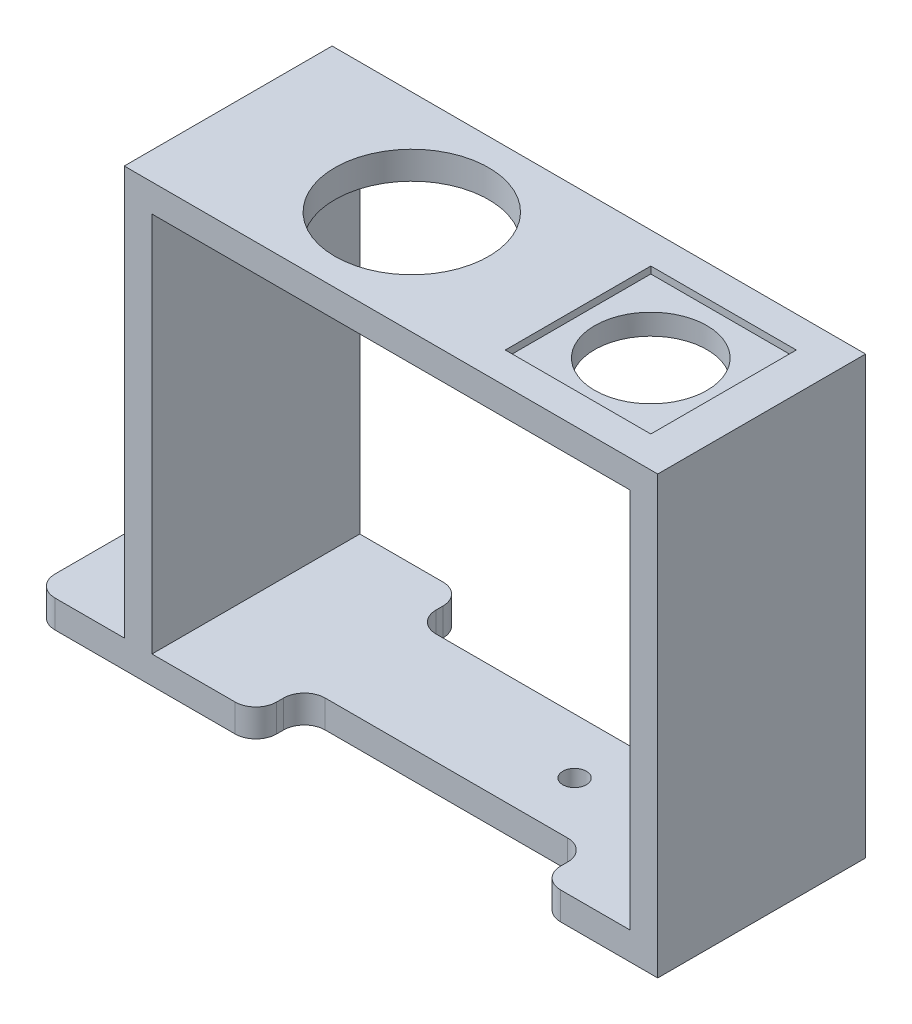
ISO-10303-21;
HEADER;
FILE_DESCRIPTION(('STEP AP214'),'2;1');
FILE_NAME('part.step','',(''),(''),'','','');
FILE_SCHEMA(('AUTOMOTIVE_DESIGN { 1 0 10303 214 1 1 1 1 }'));
ENDSEC;
DATA;
#1=APPLICATION_CONTEXT('core data for automotive mechanical design processes');
#2=APPLICATION_PROTOCOL_DEFINITION('international standard','automotive_design',2000,#1);
#3=PRODUCT_CONTEXT('',#1,'mechanical');
#4=PRODUCT('Part','Part','',(#3));
#5=PRODUCT_RELATED_PRODUCT_CATEGORY('part','',(#4));
#6=PRODUCT_DEFINITION_FORMATION('','',#4);
#7=PRODUCT_DEFINITION_CONTEXT('part definition',#1,'design');
#8=PRODUCT_DEFINITION('design','',#6,#7);
#9=PRODUCT_DEFINITION_SHAPE('','',#8);
#10=(LENGTH_UNIT() NAMED_UNIT(*) SI_UNIT(.MILLI.,.METRE.));
#11=(NAMED_UNIT(*) PLANE_ANGLE_UNIT() SI_UNIT($,.RADIAN.));
#12=(NAMED_UNIT(*) SI_UNIT($,.STERADIAN.) SOLID_ANGLE_UNIT());
#13=UNCERTAINTY_MEASURE_WITH_UNIT(LENGTH_MEASURE(1.E-05),#10,'distance_accuracy_value','');
#14=(GEOMETRIC_REPRESENTATION_CONTEXT(3) GLOBAL_UNCERTAINTY_ASSIGNED_CONTEXT((#13)) GLOBAL_UNIT_ASSIGNED_CONTEXT((#10,
#11,#12)) REPRESENTATION_CONTEXT('',''));
#15=CARTESIAN_POINT('',(0.,0.,0.));
#16=DIRECTION('',(0.,0.,1.));
#17=DIRECTION('',(1.,0.,0.));
#18=AXIS2_PLACEMENT_3D('',#15,#16,#17);
#19=CARTESIAN_POINT('',(0.,4.,0.));
#20=DIRECTION('',(0.,-1.,0.));
#21=DIRECTION('',(0.,0.,-1.));
#22=AXIS2_PLACEMENT_3D('',#19,#20,#21);
#23=PLANE('',#22);
#24=CARTESIAN_POINT('',(18.,4.,0.));
#25=DIRECTION('',(0.,1.,0.));
#26=DIRECTION('',(0.,0.,1.));
#27=AXIS2_PLACEMENT_3D('',#24,#25,#26);
#28=CIRCLE('',#27,1.7);
#29=CARTESIAN_POINT('',(18.,4.,1.7));
#30=VERTEX_POINT('',#29);
#31=EDGE_CURVE('E274',#30,#30,#28,.T.);
#32=ORIENTED_EDGE('',*,*,#31,.F.);
#33=EDGE_LOOP('',(#32));
#34=FACE_BOUND('',#33,.T.);
#35=DIRECTION('',(0.,0.,-1.));
#36=VECTOR('',#35,1.);
#37=CARTESIAN_POINT('',(28.,4.,15.));
#38=LINE('',#37,#36);
#39=CARTESIAN_POINT('',(28.,4.,12.));
#40=VERTEX_POINT('',#39);
#41=CARTESIAN_POINT('',(28.,4.,11.));
#42=VERTEX_POINT('',#41);
#43=EDGE_CURVE('E524',#40,#42,#38,.T.);
#44=ORIENTED_EDGE('',*,*,#43,.F.);
#45=CARTESIAN_POINT('',(31.,4.,12.));
#46=DIRECTION('',(0.,-1.,0.));
#47=DIRECTION('',(0.,0.,-1.));
#48=AXIS2_PLACEMENT_3D('',#45,#46,#47);
#49=CIRCLE('',#48,3.);
#50=CARTESIAN_POINT('',(31.,4.,15.));
#51=VERTEX_POINT('',#50);
#52=EDGE_CURVE('E451',#40,#51,#49,.F.);
#53=ORIENTED_EDGE('',*,*,#52,.T.);
#54=DIRECTION('',(1.,0.,0.));
#55=VECTOR('',#54,1.);
#56=CARTESIAN_POINT('',(-45.,4.,15.));
#57=LINE('',#56,#55);
#58=CARTESIAN_POINT('',(41.,4.,15.));
#59=VERTEX_POINT('',#58);
#60=EDGE_CURVE('E366',#51,#59,#57,.T.);
#61=ORIENTED_EDGE('',*,*,#60,.T.);
#62=DIRECTION('',(0.,0.,1.));
#63=VECTOR('',#62,1.);
#64=CARTESIAN_POINT('',(41.,4.,-15.));
#65=LINE('',#64,#63);
#66=CARTESIAN_POINT('',(41.,4.,-15.));
#67=VERTEX_POINT('',#66);
#68=EDGE_CURVE('E314',#67,#59,#65,.T.);
#69=ORIENTED_EDGE('',*,*,#68,.F.);
#70=DIRECTION('',(-1.,0.,0.));
#71=VECTOR('',#70,1.);
#72=CARTESIAN_POINT('',(-45.,4.,-15.));
#73=LINE('',#72,#71);
#74=CARTESIAN_POINT('',(31.,4.,-15.));
#75=VERTEX_POINT('',#74);
#76=EDGE_CURVE('E358',#67,#75,#73,.T.);
#77=ORIENTED_EDGE('',*,*,#76,.T.);
#78=CARTESIAN_POINT('',(31.,4.,-12.));
#79=DIRECTION('',(0.,-1.,0.));
#80=DIRECTION('',(0.,0.,-1.));
#81=AXIS2_PLACEMENT_3D('',#78,#79,#80);
#82=CIRCLE('',#81,3.);
#83=CARTESIAN_POINT('',(28.,4.,-12.));
#84=VERTEX_POINT('',#83);
#85=EDGE_CURVE('E445',#75,#84,#82,.F.);
#86=ORIENTED_EDGE('',*,*,#85,.T.);
#87=DIRECTION('',(0.,0.,-1.));
#88=VECTOR('',#87,1.);
#89=CARTESIAN_POINT('',(28.,4.,-15.));
#90=LINE('',#89,#88);
#91=CARTESIAN_POINT('',(28.,4.,-11.));
#92=VERTEX_POINT('',#91);
#93=EDGE_CURVE('E486',#92,#84,#90,.T.);
#94=ORIENTED_EDGE('',*,*,#93,.F.);
#95=CARTESIAN_POINT('',(25.,4.,-11.));
#96=DIRECTION('',(0.,-1.,0.));
#97=DIRECTION('',(0.,0.,-1.));
#98=AXIS2_PLACEMENT_3D('',#95,#96,#97);
#99=CIRCLE('',#98,3.);
#100=CARTESIAN_POINT('',(25.,4.,-8.));
#101=VERTEX_POINT('',#100);
#102=EDGE_CURVE('E42',#92,#101,#99,.T.);
#103=ORIENTED_EDGE('',*,*,#102,.T.);
#104=DIRECTION('',(1.,0.,0.));
#105=VECTOR('',#104,1.);
#106=CARTESIAN_POINT('',(28.,4.,-8.));
#107=LINE('',#106,#105);
#108=CARTESIAN_POINT('',(-10.,4.,-7.99999999999999));
#109=VERTEX_POINT('',#108);
#110=EDGE_CURVE('E484',#109,#101,#107,.T.);
#111=ORIENTED_EDGE('',*,*,#110,.F.);
#112=CARTESIAN_POINT('',(-10.,4.,-11.));
#113=DIRECTION('',(0.,-1.,0.));
#114=DIRECTION('',(0.,0.,-1.));
#115=AXIS2_PLACEMENT_3D('',#112,#113,#114);
#116=CIRCLE('',#115,3.);
#117=CARTESIAN_POINT('',(-13.,4.,-11.));
#118=VERTEX_POINT('',#117);
#119=EDGE_CURVE('E49',#109,#118,#116,.T.);
#120=ORIENTED_EDGE('',*,*,#119,.T.);
#121=DIRECTION('',(0.,0.,1.));
#122=VECTOR('',#121,1.);
#123=CARTESIAN_POINT('',(-13.,4.,-15.));
#124=LINE('',#123,#122);
#125=CARTESIAN_POINT('',(-13.,4.,-12.));
#126=VERTEX_POINT('',#125);
#127=EDGE_CURVE('E495',#126,#118,#124,.T.);
#128=ORIENTED_EDGE('',*,*,#127,.F.);
#129=CARTESIAN_POINT('',(-16.,4.,-12.));
#130=DIRECTION('',(0.,-1.,0.));
#131=DIRECTION('',(0.,0.,-1.));
#132=AXIS2_PLACEMENT_3D('',#129,#130,#131);
#133=CIRCLE('',#132,3.);
#134=CARTESIAN_POINT('',(-16.,4.,-15.));
#135=VERTEX_POINT('',#134);
#136=EDGE_CURVE('E447',#126,#135,#133,.F.);
#137=ORIENTED_EDGE('',*,*,#136,.T.);
#138=CARTESIAN_POINT('',(-28.,4.,-15.));
#139=VERTEX_POINT('',#138);
#140=EDGE_CURVE('E362',#135,#139,#73,.T.);
#141=ORIENTED_EDGE('',*,*,#140,.T.);
#142=DIRECTION('',(0.,0.,-1.));
#143=VECTOR('',#142,1.);
#144=CARTESIAN_POINT('',(-28.,4.,-15.));
#145=LINE('',#144,#143);
#146=CARTESIAN_POINT('',(-28.,4.,15.));
#147=VERTEX_POINT('',#146);
#148=EDGE_CURVE('E335',#147,#139,#145,.T.);
#149=ORIENTED_EDGE('',*,*,#148,.F.);
#150=CARTESIAN_POINT('',(-16.,4.,15.));
#151=VERTEX_POINT('',#150);
#152=EDGE_CURVE('E368',#147,#151,#57,.T.);
#153=ORIENTED_EDGE('',*,*,#152,.T.);
#154=CARTESIAN_POINT('',(-16.,4.,12.));
#155=DIRECTION('',(0.,-1.,0.));
#156=DIRECTION('',(0.,0.,-1.));
#157=AXIS2_PLACEMENT_3D('',#154,#155,#156);
#158=CIRCLE('',#157,3.);
#159=CARTESIAN_POINT('',(-13.,4.,12.));
#160=VERTEX_POINT('',#159);
#161=EDGE_CURVE('E449',#151,#160,#158,.F.);
#162=ORIENTED_EDGE('',*,*,#161,.T.);
#163=DIRECTION('',(0.,0.,1.));
#164=VECTOR('',#163,1.);
#165=CARTESIAN_POINT('',(-13.,4.,15.));
#166=LINE('',#165,#164);
#167=CARTESIAN_POINT('',(-13.,4.,11.));
#168=VERTEX_POINT('',#167);
#169=EDGE_CURVE('E494',#168,#160,#166,.T.);
#170=ORIENTED_EDGE('',*,*,#169,.F.);
#171=CARTESIAN_POINT('',(-10.,4.,11.));
#172=DIRECTION('',(0.,-1.,0.));
#173=DIRECTION('',(0.,0.,-1.));
#174=AXIS2_PLACEMENT_3D('',#171,#172,#173);
#175=CIRCLE('',#174,3.);
#176=CARTESIAN_POINT('',(-10.,4.,8.));
#177=VERTEX_POINT('',#176);
#178=EDGE_CURVE('E475',#168,#177,#175,.T.);
#179=ORIENTED_EDGE('',*,*,#178,.T.);
#180=DIRECTION('',(-1.,0.,0.));
#181=VECTOR('',#180,1.);
#182=CARTESIAN_POINT('',(-13.,4.,8.));
#183=LINE('',#182,#181);
#184=CARTESIAN_POINT('',(25.,4.,8.));
#185=VERTEX_POINT('',#184);
#186=EDGE_CURVE('E518',#185,#177,#183,.T.);
#187=ORIENTED_EDGE('',*,*,#186,.F.);
#188=CARTESIAN_POINT('',(25.,4.,11.));
#189=DIRECTION('',(0.,-1.,0.));
#190=DIRECTION('',(0.,0.,-1.));
#191=AXIS2_PLACEMENT_3D('',#188,#189,#190);
#192=CIRCLE('',#191,3.);
#193=EDGE_CURVE('E471',#185,#42,#192,.T.);
#194=ORIENTED_EDGE('',*,*,#193,.T.);
#195=EDGE_LOOP('',(#44,#53,#61,#69,#77,#86,#94,#103,#111,#120,#128,#137,#141,#149,#153,#162,
#170,#179,#187,#194));
#196=FACE_BOUND('',#195,.T.);
#197=ADVANCED_FACE('F34',(#34,#196),#23,.F.);
#198=CARTESIAN_POINT('',(-40.,4.,0.));
#199=DIRECTION('',(0.,1.,0.));
#200=DIRECTION('',(0.,0.,1.));
#201=AXIS2_PLACEMENT_3D('',#198,#199,#200);
#202=CIRCLE('',#201,1.7);
#203=CARTESIAN_POINT('',(-40.,4.,1.7));
#204=VERTEX_POINT('',#203);
#205=EDGE_CURVE('E352',#204,#204,#202,.T.);
#206=ORIENTED_EDGE('',*,*,#205,.F.);
#207=EDGE_LOOP('',(#206));
#208=FACE_BOUND('',#207,.T.);
#209=CARTESIAN_POINT('',(-32.,4.,-15.));
#210=VERTEX_POINT('',#209);
#211=CARTESIAN_POINT('',(-42.,4.,-15.));
#212=VERTEX_POINT('',#211);
#213=EDGE_CURVE('E363',#210,#212,#73,.T.);
#214=ORIENTED_EDGE('',*,*,#213,.T.);
#215=CARTESIAN_POINT('',(-42.,4.,-12.));
#216=DIRECTION('',(0.,-1.,0.));
#217=DIRECTION('',(0.,0.,-1.));
#218=AXIS2_PLACEMENT_3D('',#215,#216,#217);
#219=CIRCLE('',#218,3.);
#220=CARTESIAN_POINT('',(-45.,4.,-12.));
#221=VERTEX_POINT('',#220);
#222=EDGE_CURVE('E425',#212,#221,#219,.F.);
#223=ORIENTED_EDGE('',*,*,#222,.T.);
#224=DIRECTION('',(0.,0.,1.));
#225=VECTOR('',#224,1.);
#226=CARTESIAN_POINT('',(-45.,4.,15.));
#227=LINE('',#226,#225);
#228=CARTESIAN_POINT('',(-45.,4.,12.));
#229=VERTEX_POINT('',#228);
#230=EDGE_CURVE('E361',#221,#229,#227,.T.);
#231=ORIENTED_EDGE('',*,*,#230,.T.);
#232=CARTESIAN_POINT('',(-42.,4.,12.));
#233=DIRECTION('',(0.,-1.,0.));
#234=DIRECTION('',(0.,0.,-1.));
#235=AXIS2_PLACEMENT_3D('',#232,#233,#234);
#236=CIRCLE('',#235,3.);
#237=CARTESIAN_POINT('',(-42.,4.,15.));
#238=VERTEX_POINT('',#237);
#239=EDGE_CURVE('E423',#229,#238,#236,.F.);
#240=ORIENTED_EDGE('',*,*,#239,.T.);
#241=CARTESIAN_POINT('',(-32.,4.,15.));
#242=VERTEX_POINT('',#241);
#243=EDGE_CURVE('E369',#238,#242,#57,.T.);
#244=ORIENTED_EDGE('',*,*,#243,.T.);
#245=DIRECTION('',(0.,0.,1.));
#246=VECTOR('',#245,1.);
#247=CARTESIAN_POINT('',(-32.,4.,-15.));
#248=LINE('',#247,#246);
#249=EDGE_CURVE('E330',#210,#242,#248,.T.);
#250=ORIENTED_EDGE('',*,*,#249,.F.);
#251=EDGE_LOOP('',(#214,#223,#231,#240,#244,#250));
#252=FACE_BOUND('',#251,.T.);
#253=ADVANCED_FACE('F566',(#208,#252),#23,.F.);
#254=CARTESIAN_POINT('',(0.,0.,0.));
#255=DIRECTION('',(0.,-1.,0.));
#256=DIRECTION('',(0.,0.,-1.));
#257=AXIS2_PLACEMENT_3D('',#254,#255,#256);
#258=PLANE('',#257);
#259=DIRECTION('',(0.,0.,1.));
#260=VECTOR('',#259,1.);
#261=CARTESIAN_POINT('',(-45.,0.,15.));
#262=LINE('',#261,#260);
#263=CARTESIAN_POINT('',(-45.,0.,-12.));
#264=VERTEX_POINT('',#263);
#265=CARTESIAN_POINT('',(-45.,0.,12.));
#266=VERTEX_POINT('',#265);
#267=EDGE_CURVE('E376',#264,#266,#262,.T.);
#268=ORIENTED_EDGE('',*,*,#267,.F.);
#269=CARTESIAN_POINT('',(-42.,0.,-12.));
#270=DIRECTION('',(0.,-1.,0.));
#271=DIRECTION('',(0.,0.,-1.));
#272=AXIS2_PLACEMENT_3D('',#269,#270,#271);
#273=CIRCLE('',#272,3.);
#274=CARTESIAN_POINT('',(-42.,0.,-15.));
#275=VERTEX_POINT('',#274);
#276=EDGE_CURVE('E413',#264,#275,#273,.T.);
#277=ORIENTED_EDGE('',*,*,#276,.T.);
#278=DIRECTION('',(-1.,0.,0.));
#279=VECTOR('',#278,1.);
#280=CARTESIAN_POINT('',(-45.,0.,-15.));
#281=LINE('',#280,#279);
#282=CARTESIAN_POINT('',(-16.,0.,-15.));
#283=VERTEX_POINT('',#282);
#284=EDGE_CURVE('E372',#283,#275,#281,.T.);
#285=ORIENTED_EDGE('',*,*,#284,.F.);
#286=CARTESIAN_POINT('',(-16.,0.,-12.));
#287=DIRECTION('',(0.,-1.,0.));
#288=DIRECTION('',(0.,0.,-1.));
#289=AXIS2_PLACEMENT_3D('',#286,#287,#288);
#290=CIRCLE('',#289,3.);
#291=CARTESIAN_POINT('',(-13.,0.,-12.));
#292=VERTEX_POINT('',#291);
#293=EDGE_CURVE('E405',#283,#292,#290,.T.);
#294=ORIENTED_EDGE('',*,*,#293,.T.);
#295=DIRECTION('',(0.,0.,-1.));
#296=VECTOR('',#295,1.);
#297=CARTESIAN_POINT('',(-13.,0.,0.));
#298=LINE('',#297,#296);
#299=CARTESIAN_POINT('',(-13.,0.,-11.));
#300=VERTEX_POINT('',#299);
#301=EDGE_CURVE('E509',#300,#292,#298,.T.);
#302=ORIENTED_EDGE('',*,*,#301,.F.);
#303=CARTESIAN_POINT('',(-10.,0.,-11.));
#304=DIRECTION('',(0.,-1.,0.));
#305=DIRECTION('',(0.,0.,-1.));
#306=AXIS2_PLACEMENT_3D('',#303,#304,#305);
#307=CIRCLE('',#306,3.);
#308=CARTESIAN_POINT('',(-10.,0.,-7.99999999999999));
#309=VERTEX_POINT('',#308);
#310=EDGE_CURVE('E480',#300,#309,#307,.F.);
#311=ORIENTED_EDGE('',*,*,#310,.T.);
#312=DIRECTION('',(-1.,0.,0.));
#313=VECTOR('',#312,1.);
#314=CARTESIAN_POINT('',(0.,0.,-7.99999999999999));
#315=LINE('',#314,#313);
#316=CARTESIAN_POINT('',(25.,0.,-8.));
#317=VERTEX_POINT('',#316);
#318=EDGE_CURVE('E388',#317,#309,#315,.T.);
#319=ORIENTED_EDGE('',*,*,#318,.F.);
#320=CARTESIAN_POINT('',(25.,0.,-11.));
#321=DIRECTION('',(0.,-1.,0.));
#322=DIRECTION('',(0.,0.,-1.));
#323=AXIS2_PLACEMENT_3D('',#320,#321,#322);
#324=CIRCLE('',#323,3.);
#325=CARTESIAN_POINT('',(28.,0.,-11.));
#326=VERTEX_POINT('',#325);
#327=EDGE_CURVE('E11',#317,#326,#324,.F.);
#328=ORIENTED_EDGE('',*,*,#327,.T.);
#329=DIRECTION('',(0.,0.,1.));
#330=VECTOR('',#329,1.);
#331=CARTESIAN_POINT('',(28.,0.,0.));
#332=LINE('',#331,#330);
#333=CARTESIAN_POINT('',(28.,0.,-12.));
#334=VERTEX_POINT('',#333);
#335=EDGE_CURVE('E504',#334,#326,#332,.T.);
#336=ORIENTED_EDGE('',*,*,#335,.F.);
#337=CARTESIAN_POINT('',(31.,0.,-12.));
#338=DIRECTION('',(0.,-1.,0.));
#339=DIRECTION('',(0.,0.,-1.));
#340=AXIS2_PLACEMENT_3D('',#337,#338,#339);
#341=CIRCLE('',#340,3.);
#342=CARTESIAN_POINT('',(31.,0.,-15.));
#343=VERTEX_POINT('',#342);
#344=EDGE_CURVE('E403',#334,#343,#341,.T.);
#345=ORIENTED_EDGE('',*,*,#344,.T.);
#346=CARTESIAN_POINT('',(45.,0.,-15.));
#347=VERTEX_POINT('',#346);
#348=EDGE_CURVE('E373',#347,#343,#281,.T.);
#349=ORIENTED_EDGE('',*,*,#348,.F.);
#350=DIRECTION('',(0.,0.,-1.));
#351=VECTOR('',#350,1.);
#352=CARTESIAN_POINT('',(45.,0.,15.));
#353=LINE('',#352,#351);
#354=CARTESIAN_POINT('',(45.,0.,15.));
#355=VERTEX_POINT('',#354);
#356=EDGE_CURVE('E355',#355,#347,#353,.T.);
#357=ORIENTED_EDGE('',*,*,#356,.F.);
#358=DIRECTION('',(1.,0.,0.));
#359=VECTOR('',#358,1.);
#360=CARTESIAN_POINT('',(-45.,0.,15.));
#361=LINE('',#360,#359);
#362=CARTESIAN_POINT('',(31.,0.,15.));
#363=VERTEX_POINT('',#362);
#364=EDGE_CURVE('E379',#363,#355,#361,.T.);
#365=ORIENTED_EDGE('',*,*,#364,.F.);
#366=CARTESIAN_POINT('',(31.,0.,12.));
#367=DIRECTION('',(0.,-1.,0.));
#368=DIRECTION('',(0.,0.,-1.));
#369=AXIS2_PLACEMENT_3D('',#366,#367,#368);
#370=CIRCLE('',#369,3.);
#371=CARTESIAN_POINT('',(28.,0.,12.));
#372=VERTEX_POINT('',#371);
#373=EDGE_CURVE('E409',#363,#372,#370,.T.);
#374=ORIENTED_EDGE('',*,*,#373,.T.);
#375=DIRECTION('',(0.,0.,1.));
#376=VECTOR('',#375,1.);
#377=CARTESIAN_POINT('',(28.,0.,0.));
#378=LINE('',#377,#376);
#379=CARTESIAN_POINT('',(28.,0.,11.));
#380=VERTEX_POINT('',#379);
#381=EDGE_CURVE('E516',#380,#372,#378,.T.);
#382=ORIENTED_EDGE('',*,*,#381,.F.);
#383=CARTESIAN_POINT('',(25.,0.,11.));
#384=DIRECTION('',(0.,-1.,0.));
#385=DIRECTION('',(0.,0.,-1.));
#386=AXIS2_PLACEMENT_3D('',#383,#384,#385);
#387=CIRCLE('',#386,3.);
#388=CARTESIAN_POINT('',(25.,0.,8.));
#389=VERTEX_POINT('',#388);
#390=EDGE_CURVE('E473',#380,#389,#387,.F.);
#391=ORIENTED_EDGE('',*,*,#390,.T.);
#392=DIRECTION('',(1.,0.,0.));
#393=VECTOR('',#392,1.);
#394=CARTESIAN_POINT('',(0.,0.,8.));
#395=LINE('',#394,#393);
#396=CARTESIAN_POINT('',(-10.,0.,8.));
#397=VERTEX_POINT('',#396);
#398=EDGE_CURVE('E395',#397,#389,#395,.T.);
#399=ORIENTED_EDGE('',*,*,#398,.F.);
#400=CARTESIAN_POINT('',(-10.,0.,11.));
#401=DIRECTION('',(0.,-1.,0.));
#402=DIRECTION('',(0.,0.,-1.));
#403=AXIS2_PLACEMENT_3D('',#400,#401,#402);
#404=CIRCLE('',#403,3.);
#405=CARTESIAN_POINT('',(-13.,0.,11.));
#406=VERTEX_POINT('',#405);
#407=EDGE_CURVE('E477',#397,#406,#404,.F.);
#408=ORIENTED_EDGE('',*,*,#407,.T.);
#409=DIRECTION('',(0.,0.,-1.));
#410=VECTOR('',#409,1.);
#411=CARTESIAN_POINT('',(-13.,0.,0.));
#412=LINE('',#411,#410);
#413=CARTESIAN_POINT('',(-13.,0.,12.));
#414=VERTEX_POINT('',#413);
#415=EDGE_CURVE('E511',#414,#406,#412,.T.);
#416=ORIENTED_EDGE('',*,*,#415,.F.);
#417=CARTESIAN_POINT('',(-16.,0.,12.));
#418=DIRECTION('',(0.,-1.,0.));
#419=DIRECTION('',(0.,0.,-1.));
#420=AXIS2_PLACEMENT_3D('',#417,#418,#419);
#421=CIRCLE('',#420,3.);
#422=CARTESIAN_POINT('',(-16.,0.,15.));
#423=VERTEX_POINT('',#422);
#424=EDGE_CURVE('E407',#414,#423,#421,.T.);
#425=ORIENTED_EDGE('',*,*,#424,.T.);
#426=CARTESIAN_POINT('',(-42.,0.,15.));
#427=VERTEX_POINT('',#426);
#428=EDGE_CURVE('E381',#427,#423,#361,.T.);
#429=ORIENTED_EDGE('',*,*,#428,.F.);
#430=CARTESIAN_POINT('',(-42.,0.,12.));
#431=DIRECTION('',(0.,-1.,0.));
#432=DIRECTION('',(0.,0.,-1.));
#433=AXIS2_PLACEMENT_3D('',#430,#431,#432);
#434=CIRCLE('',#433,3.);
#435=EDGE_CURVE('E411',#427,#266,#434,.T.);
#436=ORIENTED_EDGE('',*,*,#435,.T.);
#437=EDGE_LOOP('',(#268,#277,#285,#294,#302,#311,#319,#328,#336,#345,#349,#357,#365,#374,#382,
#391,#399,#408,#416,#425,#429,#436));
#438=FACE_BOUND('',#437,.T.);
#439=CARTESIAN_POINT('',(18.,0.,0.));
#440=DIRECTION('',(0.,-1.,0.));
#441=DIRECTION('',(0.,0.,-1.));
#442=AXIS2_PLACEMENT_3D('',#439,#440,#441);
#443=CIRCLE('',#442,1.7);
#444=CARTESIAN_POINT('',(18.,0.,-1.7));
#445=VERTEX_POINT('',#444);
#446=EDGE_CURVE('E281',#445,#445,#443,.T.);
#447=ORIENTED_EDGE('',*,*,#446,.F.);
#448=EDGE_LOOP('',(#447));
#449=FACE_BOUND('',#448,.T.);
#450=CARTESIAN_POINT('',(-40.,0.,0.));
#451=DIRECTION('',(0.,1.,0.));
#452=DIRECTION('',(0.,0.,1.));
#453=AXIS2_PLACEMENT_3D('',#450,#451,#452);
#454=CIRCLE('',#453,1.7);
#455=CARTESIAN_POINT('',(-40.,0.,1.7));
#456=VERTEX_POINT('',#455);
#457=EDGE_CURVE('E351',#456,#456,#454,.T.);
#458=ORIENTED_EDGE('',*,*,#457,.T.);
#459=EDGE_LOOP('',(#458));
#460=FACE_BOUND('',#459,.T.);
#461=ADVANCED_FACE('F502',(#438,#449,#460),#258,.T.);
#462=CARTESIAN_POINT('',(45.,4.,15.));
#463=DIRECTION('',(-1.,0.,0.));
#464=DIRECTION('',(0.,0.,1.));
#465=AXIS2_PLACEMENT_3D('',#462,#463,#464);
#466=PLANE('',#465);
#467=ORIENTED_EDGE('',*,*,#356,.T.);
#468=DIRECTION('',(0.,-1.,0.));
#469=VECTOR('',#468,1.);
#470=CARTESIAN_POINT('',(45.,4.,-15.));
#471=LINE('',#470,#469);
#472=CARTESIAN_POINT('',(45.,63.,-15.));
#473=VERTEX_POINT('',#472);
#474=EDGE_CURVE('E385',#473,#347,#471,.T.);
#475=ORIENTED_EDGE('',*,*,#474,.F.);
#476=DIRECTION('',(0.,0.,-1.));
#477=VECTOR('',#476,1.);
#478=CARTESIAN_POINT('',(45.,63.,-15.));
#479=LINE('',#478,#477);
#480=CARTESIAN_POINT('',(45.,63.,15.));
#481=VERTEX_POINT('',#480);
#482=EDGE_CURVE('E308',#481,#473,#479,.T.);
#483=ORIENTED_EDGE('',*,*,#482,.F.);
#484=DIRECTION('',(0.,-1.,0.));
#485=VECTOR('',#484,1.);
#486=CARTESIAN_POINT('',(45.,4.,15.));
#487=LINE('',#486,#485);
#488=EDGE_CURVE('E382',#481,#355,#487,.T.);
#489=ORIENTED_EDGE('',*,*,#488,.T.);
#490=EDGE_LOOP('',(#467,#475,#483,#489));
#491=FACE_BOUND('',#490,.T.);
#492=ADVANCED_FACE('F578',(#491),#466,.F.);
#493=CARTESIAN_POINT('',(-45.,4.,-15.));
#494=DIRECTION('',(0.,0.,1.));
#495=DIRECTION('',(1.,0.,0.));
#496=AXIS2_PLACEMENT_3D('',#493,#494,#495);
#497=PLANE('',#496);
#498=ORIENTED_EDGE('',*,*,#284,.T.);
#499=DIRECTION('',(0.,-1.,0.));
#500=VECTOR('',#499,1.);
#501=CARTESIAN_POINT('',(-42.,4.,-15.));
#502=LINE('',#501,#500);
#503=EDGE_CURVE('E421',#275,#212,#502,.F.);
#504=ORIENTED_EDGE('',*,*,#503,.T.);
#505=ORIENTED_EDGE('',*,*,#213,.F.);
#506=DIRECTION('',(0.,-1.,0.));
#507=VECTOR('',#506,1.);
#508=CARTESIAN_POINT('',(-32.,59.,-15.));
#509=LINE('',#508,#507);
#510=CARTESIAN_POINT('',(-32.,63.,-15.));
#511=VERTEX_POINT('',#510);
#512=EDGE_CURVE('E334',#511,#210,#509,.T.);
#513=ORIENTED_EDGE('',*,*,#512,.F.);
#514=DIRECTION('',(-1.,0.,0.));
#515=VECTOR('',#514,1.);
#516=CARTESIAN_POINT('',(-32.,63.,-15.));
#517=LINE('',#516,#515);
#518=EDGE_CURVE('E311',#473,#511,#517,.T.);
#519=ORIENTED_EDGE('',*,*,#518,.F.);
#520=ORIENTED_EDGE('',*,*,#474,.T.);
#521=ORIENTED_EDGE('',*,*,#348,.T.);
#522=DIRECTION('',(0.,1.,0.));
#523=VECTOR('',#522,1.);
#524=CARTESIAN_POINT('',(31.,4.,-15.));
#525=LINE('',#524,#523);
#526=EDGE_CURVE('E415',#343,#75,#525,.T.);
#527=ORIENTED_EDGE('',*,*,#526,.T.);
#528=ORIENTED_EDGE('',*,*,#76,.F.);
#529=DIRECTION('',(0.,-1.,0.));
#530=VECTOR('',#529,1.);
#531=CARTESIAN_POINT('',(41.,59.,-15.));
#532=LINE('',#531,#530);
#533=CARTESIAN_POINT('',(41.,59.,-15.));
#534=VERTEX_POINT('',#533);
#535=EDGE_CURVE('E327',#534,#67,#532,.T.);
#536=ORIENTED_EDGE('',*,*,#535,.F.);
#537=DIRECTION('',(-1.,0.,0.));
#538=VECTOR('',#537,1.);
#539=CARTESIAN_POINT('',(-32.,59.,-15.));
#540=LINE('',#539,#538);
#541=CARTESIAN_POINT('',(-28.,59.,-15.));
#542=VERTEX_POINT('',#541);
#543=EDGE_CURVE('E305',#534,#542,#540,.T.);
#544=ORIENTED_EDGE('',*,*,#543,.T.);
#545=DIRECTION('',(0.,-1.,0.));
#546=VECTOR('',#545,1.);
#547=CARTESIAN_POINT('',(-28.,59.,-15.));
#548=LINE('',#547,#546);
#549=EDGE_CURVE('E342',#542,#139,#548,.T.);
#550=ORIENTED_EDGE('',*,*,#549,.T.);
#551=ORIENTED_EDGE('',*,*,#140,.F.);
#552=DIRECTION('',(0.,-1.,0.));
#553=VECTOR('',#552,1.);
#554=CARTESIAN_POINT('',(-16.,4.,-15.));
#555=LINE('',#554,#553);
#556=EDGE_CURVE('E418',#135,#283,#555,.T.);
#557=ORIENTED_EDGE('',*,*,#556,.T.);
#558=EDGE_LOOP('',(#498,#504,#505,#513,#519,#520,#521,#527,#528,#536,#544,#550,#551,#557));
#559=FACE_BOUND('',#558,.T.);
#560=ADVANCED_FACE('F558',(#559),#497,.F.);
#561=CARTESIAN_POINT('',(-45.,4.,15.));
#562=DIRECTION('',(1.,0.,0.));
#563=DIRECTION('',(0.,0.,-1.));
#564=AXIS2_PLACEMENT_3D('',#561,#562,#563);
#565=PLANE('',#564);
#566=ORIENTED_EDGE('',*,*,#230,.F.);
#567=DIRECTION('',(0.,-1.,0.));
#568=VECTOR('',#567,1.);
#569=CARTESIAN_POINT('',(-45.,4.,-12.));
#570=LINE('',#569,#568);
#571=EDGE_CURVE('E400',#221,#264,#570,.T.);
#572=ORIENTED_EDGE('',*,*,#571,.T.);
#573=ORIENTED_EDGE('',*,*,#267,.T.);
#574=DIRECTION('',(0.,-1.,0.));
#575=VECTOR('',#574,1.);
#576=CARTESIAN_POINT('',(-45.,4.,12.));
#577=LINE('',#576,#575);
#578=EDGE_CURVE('E398',#266,#229,#577,.F.);
#579=ORIENTED_EDGE('',*,*,#578,.T.);
#580=EDGE_LOOP('',(#566,#572,#573,#579));
#581=FACE_BOUND('',#580,.T.);
#582=ADVANCED_FACE('F610',(#581),#565,.F.);
#583=CARTESIAN_POINT('',(-45.,4.,15.));
#584=DIRECTION('',(0.,0.,-1.));
#585=DIRECTION('',(-1.,0.,0.));
#586=AXIS2_PLACEMENT_3D('',#583,#584,#585);
#587=PLANE('',#586);
#588=ORIENTED_EDGE('',*,*,#243,.F.);
#589=DIRECTION('',(0.,-1.,0.));
#590=VECTOR('',#589,1.);
#591=CARTESIAN_POINT('',(-42.,4.,15.));
#592=LINE('',#591,#590);
#593=EDGE_CURVE('E433',#238,#427,#592,.T.);
#594=ORIENTED_EDGE('',*,*,#593,.T.);
#595=ORIENTED_EDGE('',*,*,#428,.T.);
#596=DIRECTION('',(0.,1.,0.));
#597=VECTOR('',#596,1.);
#598=CARTESIAN_POINT('',(-16.,4.,15.));
#599=LINE('',#598,#597);
#600=EDGE_CURVE('E427',#423,#151,#599,.T.);
#601=ORIENTED_EDGE('',*,*,#600,.T.);
#602=ORIENTED_EDGE('',*,*,#152,.F.);
#603=DIRECTION('',(0.,-1.,0.));
#604=VECTOR('',#603,1.);
#605=CARTESIAN_POINT('',(-28.,59.,15.));
#606=LINE('',#605,#604);
#607=CARTESIAN_POINT('',(-28.,59.,15.));
#608=VERTEX_POINT('',#607);
#609=EDGE_CURVE('E345',#608,#147,#606,.T.);
#610=ORIENTED_EDGE('',*,*,#609,.F.);
#611=DIRECTION('',(1.,0.,0.));
#612=VECTOR('',#611,1.);
#613=CARTESIAN_POINT('',(-32.,59.,15.));
#614=LINE('',#613,#612);
#615=CARTESIAN_POINT('',(41.,59.,15.));
#616=VERTEX_POINT('',#615);
#617=EDGE_CURVE('E298',#608,#616,#614,.T.);
#618=ORIENTED_EDGE('',*,*,#617,.T.);
#619=DIRECTION('',(0.,-1.,0.));
#620=VECTOR('',#619,1.);
#621=CARTESIAN_POINT('',(41.,59.,15.));
#622=LINE('',#621,#620);
#623=EDGE_CURVE('E322',#616,#59,#622,.T.);
#624=ORIENTED_EDGE('',*,*,#623,.T.);
#625=ORIENTED_EDGE('',*,*,#60,.F.);
#626=DIRECTION('',(0.,-1.,0.));
#627=VECTOR('',#626,1.);
#628=CARTESIAN_POINT('',(31.,4.,15.));
#629=LINE('',#628,#627);
#630=EDGE_CURVE('E430',#51,#363,#629,.T.);
#631=ORIENTED_EDGE('',*,*,#630,.T.);
#632=ORIENTED_EDGE('',*,*,#364,.T.);
#633=ORIENTED_EDGE('',*,*,#488,.F.);
#634=DIRECTION('',(1.,0.,0.));
#635=VECTOR('',#634,1.);
#636=CARTESIAN_POINT('',(-32.,63.,15.));
#637=LINE('',#636,#635);
#638=CARTESIAN_POINT('',(-32.,63.,15.));
#639=VERTEX_POINT('',#638);
#640=EDGE_CURVE('E304',#639,#481,#637,.T.);
#641=ORIENTED_EDGE('',*,*,#640,.F.);
#642=DIRECTION('',(0.,-1.,0.));
#643=VECTOR('',#642,1.);
#644=CARTESIAN_POINT('',(-32.,59.,15.));
#645=LINE('',#644,#643);
#646=EDGE_CURVE('E348',#639,#242,#645,.T.);
#647=ORIENTED_EDGE('',*,*,#646,.T.);
#648=EDGE_LOOP('',(#588,#594,#595,#601,#602,#610,#618,#624,#625,#631,#632,#633,#641,#647));
#649=FACE_BOUND('',#648,.T.);
#650=ADVANCED_FACE('F542',(#649),#587,.F.);
#651=CARTESIAN_POINT('',(-40.,4.,0.));
#652=DIRECTION('',(0.,-1.,0.));
#653=DIRECTION('',(0.,0.,-1.));
#654=AXIS2_PLACEMENT_3D('',#651,#652,#653);
#655=CYLINDRICAL_SURFACE('',#654,1.7);
#656=ORIENTED_EDGE('',*,*,#205,.T.);
#657=EDGE_LOOP('',(#656));
#658=FACE_BOUND('',#657,.T.);
#659=ORIENTED_EDGE('',*,*,#457,.F.);
#660=EDGE_LOOP('',(#659));
#661=FACE_BOUND('',#660,.T.);
#662=ADVANCED_FACE('F604',(#658,#661),#655,.F.);
#663=CARTESIAN_POINT('',(-32.,59.,-15.));
#664=DIRECTION('',(1.,0.,0.));
#665=DIRECTION('',(0.,0.,-1.));
#666=AXIS2_PLACEMENT_3D('',#663,#664,#665);
#667=PLANE('',#666);
#668=ORIENTED_EDGE('',*,*,#249,.T.);
#669=ORIENTED_EDGE('',*,*,#646,.F.);
#670=DIRECTION('',(0.,0.,1.));
#671=VECTOR('',#670,1.);
#672=CARTESIAN_POINT('',(-32.,63.,-15.));
#673=LINE('',#672,#671);
#674=EDGE_CURVE('E301',#511,#639,#673,.T.);
#675=ORIENTED_EDGE('',*,*,#674,.F.);
#676=ORIENTED_EDGE('',*,*,#512,.T.);
#677=EDGE_LOOP('',(#668,#669,#675,#676));
#678=FACE_BOUND('',#677,.T.);
#679=ADVANCED_FACE('F571',(#678),#667,.F.);
#680=CARTESIAN_POINT('',(-28.,59.,-15.));
#681=DIRECTION('',(-1.,0.,0.));
#682=DIRECTION('',(0.,0.,1.));
#683=AXIS2_PLACEMENT_3D('',#680,#681,#682);
#684=PLANE('',#683);
#685=ORIENTED_EDGE('',*,*,#148,.T.);
#686=ORIENTED_EDGE('',*,*,#549,.F.);
#687=DIRECTION('',(0.,0.,-1.));
#688=VECTOR('',#687,1.);
#689=CARTESIAN_POINT('',(-28.,59.,-15.));
#690=LINE('',#689,#688);
#691=EDGE_CURVE('E331',#608,#542,#690,.T.);
#692=ORIENTED_EDGE('',*,*,#691,.F.);
#693=ORIENTED_EDGE('',*,*,#609,.T.);
#694=EDGE_LOOP('',(#685,#686,#692,#693));
#695=FACE_BOUND('',#694,.T.);
#696=ADVANCED_FACE('F555',(#695),#684,.F.);
#697=CARTESIAN_POINT('',(41.,59.,-15.));
#698=DIRECTION('',(1.,0.,0.));
#699=DIRECTION('',(0.,0.,-1.));
#700=AXIS2_PLACEMENT_3D('',#697,#698,#699);
#701=PLANE('',#700);
#702=ORIENTED_EDGE('',*,*,#68,.T.);
#703=ORIENTED_EDGE('',*,*,#623,.F.);
#704=DIRECTION('',(0.,0.,1.));
#705=VECTOR('',#704,1.);
#706=CARTESIAN_POINT('',(41.,59.,-15.));
#707=LINE('',#706,#705);
#708=EDGE_CURVE('E319',#534,#616,#707,.T.);
#709=ORIENTED_EDGE('',*,*,#708,.F.);
#710=ORIENTED_EDGE('',*,*,#535,.T.);
#711=EDGE_LOOP('',(#702,#703,#709,#710));
#712=FACE_BOUND('',#711,.T.);
#713=ADVANCED_FACE('F584',(#712),#701,.F.);
#714=CARTESIAN_POINT('',(0.,59.,0.));
#715=DIRECTION('',(0.,1.,0.));
#716=DIRECTION('',(0.,0.,1.));
#717=AXIS2_PLACEMENT_3D('',#714,#715,#716);
#718=PLANE('',#717);
#719=CARTESIAN_POINT('',(29.,59.,0.));
#720=DIRECTION('',(0.,1.,0.));
#721=DIRECTION('',(0.,0.,1.));
#722=AXIS2_PLACEMENT_3D('',#719,#720,#721);
#723=CIRCLE('',#722,8.1);
#724=CARTESIAN_POINT('',(29.,59.,8.1));
#725=VERTEX_POINT('',#724);
#726=EDGE_CURVE('E291',#725,#725,#723,.T.);
#727=ORIENTED_EDGE('',*,*,#726,.T.);
#728=EDGE_LOOP('',(#727));
#729=FACE_BOUND('',#728,.T.);
#730=CARTESIAN_POINT('',(-5.50000000000002,59.,0.));
#731=DIRECTION('',(0.,1.,0.));
#732=DIRECTION('',(0.,0.,1.));
#733=AXIS2_PLACEMENT_3D('',#730,#731,#732);
#734=CIRCLE('',#733,11.1);
#735=CARTESIAN_POINT('',(-5.50000000000002,59.,11.1));
#736=VERTEX_POINT('',#735);
#737=EDGE_CURVE('E294',#736,#736,#734,.T.);
#738=ORIENTED_EDGE('',*,*,#737,.T.);
#739=EDGE_LOOP('',(#738));
#740=FACE_BOUND('',#739,.T.);
#741=ORIENTED_EDGE('',*,*,#617,.F.);
#742=ORIENTED_EDGE('',*,*,#691,.T.);
#743=ORIENTED_EDGE('',*,*,#543,.F.);
#744=ORIENTED_EDGE('',*,*,#708,.T.);
#745=EDGE_LOOP('',(#741,#742,#743,#744));
#746=FACE_BOUND('',#745,.T.);
#747=ADVANCED_FACE('F564',(#729,#740,#746),#718,.F.);
#748=CARTESIAN_POINT('',(0.,63.,0.));
#749=DIRECTION('',(0.,1.,0.));
#750=DIRECTION('',(0.,0.,1.));
#751=AXIS2_PLACEMENT_3D('',#748,#749,#750);
#752=PLANE('',#751);
#753=DIRECTION('',(0.,0.,-1.));
#754=VECTOR('',#753,1.);
#755=CARTESIAN_POINT('',(39.5,63.,10.5));
#756=LINE('',#755,#754);
#757=CARTESIAN_POINT('',(39.5,63.,10.5));
#758=VERTEX_POINT('',#757);
#759=CARTESIAN_POINT('',(39.5,63.,-10.5));
#760=VERTEX_POINT('',#759);
#761=EDGE_CURVE('E250',#758,#760,#756,.T.);
#762=ORIENTED_EDGE('',*,*,#761,.F.);
#763=DIRECTION('',(1.,0.,0.));
#764=VECTOR('',#763,1.);
#765=CARTESIAN_POINT('',(18.5,63.,10.5));
#766=LINE('',#765,#764);
#767=CARTESIAN_POINT('',(18.5,63.,10.5));
#768=VERTEX_POINT('',#767);
#769=EDGE_CURVE('E268',#768,#758,#766,.T.);
#770=ORIENTED_EDGE('',*,*,#769,.F.);
#771=DIRECTION('',(0.,0.,1.));
#772=VECTOR('',#771,1.);
#773=CARTESIAN_POINT('',(18.5,63.,10.5));
#774=LINE('',#773,#772);
#775=CARTESIAN_POINT('',(18.5,63.,-10.5));
#776=VERTEX_POINT('',#775);
#777=EDGE_CURVE('E271',#776,#768,#774,.T.);
#778=ORIENTED_EDGE('',*,*,#777,.F.);
#779=DIRECTION('',(-1.,0.,0.));
#780=VECTOR('',#779,1.);
#781=CARTESIAN_POINT('',(18.5,63.,-10.5));
#782=LINE('',#781,#780);
#783=EDGE_CURVE('E280',#760,#776,#782,.T.);
#784=ORIENTED_EDGE('',*,*,#783,.F.);
#785=EDGE_LOOP('',(#762,#770,#778,#784));
#786=FACE_BOUND('',#785,.T.);
#787=ORIENTED_EDGE('',*,*,#674,.T.);
#788=ORIENTED_EDGE('',*,*,#640,.T.);
#789=ORIENTED_EDGE('',*,*,#482,.T.);
#790=ORIENTED_EDGE('',*,*,#518,.T.);
#791=EDGE_LOOP('',(#787,#788,#789,#790));
#792=FACE_BOUND('',#791,.T.);
#793=CARTESIAN_POINT('',(-5.50000000000002,63.,0.));
#794=DIRECTION('',(0.,1.,0.));
#795=DIRECTION('',(0.,0.,1.));
#796=AXIS2_PLACEMENT_3D('',#793,#794,#795);
#797=CIRCLE('',#796,11.1);
#798=CARTESIAN_POINT('',(-5.50000000000002,63.,11.1));
#799=VERTEX_POINT('',#798);
#800=EDGE_CURVE('E295',#799,#799,#797,.T.);
#801=ORIENTED_EDGE('',*,*,#800,.F.);
#802=EDGE_LOOP('',(#801));
#803=FACE_BOUND('',#802,.T.);
#804=ADVANCED_FACE('F574',(#786,#792,#803),#752,.T.);
#805=CARTESIAN_POINT('',(-5.50000000000002,63.,0.));
#806=DIRECTION('',(0.,-1.,0.));
#807=DIRECTION('',(0.,0.,-1.));
#808=AXIS2_PLACEMENT_3D('',#805,#806,#807);
#809=CYLINDRICAL_SURFACE('',#808,11.1);
#810=ORIENTED_EDGE('',*,*,#800,.T.);
#811=EDGE_LOOP('',(#810));
#812=FACE_BOUND('',#811,.T.);
#813=ORIENTED_EDGE('',*,*,#737,.F.);
#814=EDGE_LOOP('',(#813));
#815=FACE_BOUND('',#814,.T.);
#816=ADVANCED_FACE('F866',(#812,#815),#809,.F.);
#817=CARTESIAN_POINT('',(29.,59.,0.));
#818=DIRECTION('',(0.,1.,0.));
#819=DIRECTION('',(0.,0.,1.));
#820=AXIS2_PLACEMENT_3D('',#817,#818,#819);
#821=CYLINDRICAL_SURFACE('',#820,8.1);
#822=CARTESIAN_POINT('',(29.,62.,0.));
#823=DIRECTION('',(0.,-1.,0.));
#824=DIRECTION('',(0.,0.,-1.));
#825=AXIS2_PLACEMENT_3D('',#822,#823,#824);
#826=CIRCLE('',#825,8.1);
#827=CARTESIAN_POINT('',(29.,62.,-8.1));
#828=VERTEX_POINT('',#827);
#829=EDGE_CURVE('E287',#828,#828,#826,.F.);
#830=ORIENTED_EDGE('',*,*,#829,.T.);
#831=EDGE_LOOP('',(#830));
#832=FACE_BOUND('',#831,.T.);
#833=ORIENTED_EDGE('',*,*,#726,.F.);
#834=EDGE_LOOP('',(#833));
#835=FACE_BOUND('',#834,.T.);
#836=ADVANCED_FACE('F857',(#832,#835),#821,.F.);
#837=CARTESIAN_POINT('',(0.,62.,0.));
#838=DIRECTION('',(0.,-1.,0.));
#839=DIRECTION('',(0.,0.,-1.));
#840=AXIS2_PLACEMENT_3D('',#837,#838,#839);
#841=PLANE('',#840);
#842=DIRECTION('',(0.,0.,-1.));
#843=VECTOR('',#842,1.);
#844=CARTESIAN_POINT('',(39.5,62.,10.5));
#845=LINE('',#844,#843);
#846=CARTESIAN_POINT('',(39.5,62.,10.5));
#847=VERTEX_POINT('',#846);
#848=CARTESIAN_POINT('',(39.5,62.,-10.5));
#849=VERTEX_POINT('',#848);
#850=EDGE_CURVE('E247',#847,#849,#845,.T.);
#851=ORIENTED_EDGE('',*,*,#850,.T.);
#852=DIRECTION('',(-1.,0.,0.));
#853=VECTOR('',#852,1.);
#854=CARTESIAN_POINT('',(18.5,62.,-10.5));
#855=LINE('',#854,#853);
#856=CARTESIAN_POINT('',(18.5,62.,-10.5));
#857=VERTEX_POINT('',#856);
#858=EDGE_CURVE('E258',#849,#857,#855,.T.);
#859=ORIENTED_EDGE('',*,*,#858,.T.);
#860=DIRECTION('',(0.,0.,1.));
#861=VECTOR('',#860,1.);
#862=CARTESIAN_POINT('',(18.5,62.,10.5));
#863=LINE('',#862,#861);
#864=CARTESIAN_POINT('',(18.5,62.,10.5));
#865=VERTEX_POINT('',#864);
#866=EDGE_CURVE('E263',#857,#865,#863,.T.);
#867=ORIENTED_EDGE('',*,*,#866,.T.);
#868=DIRECTION('',(1.,0.,0.));
#869=VECTOR('',#868,1.);
#870=CARTESIAN_POINT('',(18.5,62.,10.5));
#871=LINE('',#870,#869);
#872=EDGE_CURVE('E255',#865,#847,#871,.T.);
#873=ORIENTED_EDGE('',*,*,#872,.T.);
#874=EDGE_LOOP('',(#851,#859,#867,#873));
#875=FACE_BOUND('',#874,.T.);
#876=ORIENTED_EDGE('',*,*,#829,.F.);
#877=EDGE_LOOP('',(#876));
#878=FACE_BOUND('',#877,.T.);
#879=ADVANCED_FACE('F265',(#875,#878),#841,.F.);
#880=CARTESIAN_POINT('',(39.5,62.,10.5));
#881=DIRECTION('',(1.,0.,0.));
#882=DIRECTION('',(0.,0.,-1.));
#883=AXIS2_PLACEMENT_3D('',#880,#881,#882);
#884=PLANE('',#883);
#885=ORIENTED_EDGE('',*,*,#761,.T.);
#886=DIRECTION('',(0.,1.,0.));
#887=VECTOR('',#886,1.);
#888=CARTESIAN_POINT('',(39.5,62.,-10.5));
#889=LINE('',#888,#887);
#890=EDGE_CURVE('E243',#849,#760,#889,.T.);
#891=ORIENTED_EDGE('',*,*,#890,.F.);
#892=ORIENTED_EDGE('',*,*,#850,.F.);
#893=DIRECTION('',(0.,1.,0.));
#894=VECTOR('',#893,1.);
#895=CARTESIAN_POINT('',(39.5,62.,10.5));
#896=LINE('',#895,#894);
#897=EDGE_CURVE('E285',#847,#758,#896,.T.);
#898=ORIENTED_EDGE('',*,*,#897,.T.);
#899=EDGE_LOOP('',(#885,#891,#892,#898));
#900=FACE_BOUND('',#899,.T.);
#901=ADVANCED_FACE('F245',(#900),#884,.F.);
#902=CARTESIAN_POINT('',(18.5,62.,10.5));
#903=DIRECTION('',(0.,0.,1.));
#904=DIRECTION('',(1.,0.,0.));
#905=AXIS2_PLACEMENT_3D('',#902,#903,#904);
#906=PLANE('',#905);
#907=ORIENTED_EDGE('',*,*,#769,.T.);
#908=ORIENTED_EDGE('',*,*,#897,.F.);
#909=ORIENTED_EDGE('',*,*,#872,.F.);
#910=DIRECTION('',(0.,1.,0.));
#911=VECTOR('',#910,1.);
#912=CARTESIAN_POINT('',(18.5,62.,10.5));
#913=LINE('',#912,#911);
#914=EDGE_CURVE('E288',#865,#768,#913,.T.);
#915=ORIENTED_EDGE('',*,*,#914,.T.);
#916=EDGE_LOOP('',(#907,#908,#909,#915));
#917=FACE_BOUND('',#916,.T.);
#918=ADVANCED_FACE('F830',(#917),#906,.F.);
#919=CARTESIAN_POINT('',(18.5,62.,10.5));
#920=DIRECTION('',(-1.,0.,0.));
#921=DIRECTION('',(0.,0.,1.));
#922=AXIS2_PLACEMENT_3D('',#919,#920,#921);
#923=PLANE('',#922);
#924=ORIENTED_EDGE('',*,*,#777,.T.);
#925=ORIENTED_EDGE('',*,*,#914,.F.);
#926=ORIENTED_EDGE('',*,*,#866,.F.);
#927=DIRECTION('',(0.,1.,0.));
#928=VECTOR('',#927,1.);
#929=CARTESIAN_POINT('',(18.5,62.,-10.5));
#930=LINE('',#929,#928);
#931=EDGE_CURVE('E254',#857,#776,#930,.T.);
#932=ORIENTED_EDGE('',*,*,#931,.T.);
#933=EDGE_LOOP('',(#924,#925,#926,#932));
#934=FACE_BOUND('',#933,.T.);
#935=ADVANCED_FACE('F821',(#934),#923,.F.);
#936=CARTESIAN_POINT('',(18.5,62.,-10.5));
#937=DIRECTION('',(0.,0.,-1.));
#938=DIRECTION('',(-1.,0.,0.));
#939=AXIS2_PLACEMENT_3D('',#936,#937,#938);
#940=PLANE('',#939);
#941=ORIENTED_EDGE('',*,*,#783,.T.);
#942=ORIENTED_EDGE('',*,*,#931,.F.);
#943=ORIENTED_EDGE('',*,*,#858,.F.);
#944=ORIENTED_EDGE('',*,*,#890,.T.);
#945=EDGE_LOOP('',(#941,#942,#943,#944));
#946=FACE_BOUND('',#945,.T.);
#947=ADVANCED_FACE('F259',(#946),#940,.F.);
#948=CARTESIAN_POINT('',(18.,-1.,0.));
#949=DIRECTION('',(0.,1.,0.));
#950=DIRECTION('',(0.,0.,1.));
#951=AXIS2_PLACEMENT_3D('',#948,#949,#950);
#952=CYLINDRICAL_SURFACE('',#951,1.7);
#953=ORIENTED_EDGE('',*,*,#446,.T.);
#954=EDGE_LOOP('',(#953));
#955=FACE_BOUND('',#954,.T.);
#956=ORIENTED_EDGE('',*,*,#31,.T.);
#957=EDGE_LOOP('',(#956));
#958=FACE_BOUND('',#957,.T.);
#959=ADVANCED_FACE('F759',(#955,#958),#952,.F.);
#960=CARTESIAN_POINT('',(-13.,-6.,15.));
#961=DIRECTION('',(-1.,0.,0.));
#962=DIRECTION('',(0.,0.,1.));
#963=AXIS2_PLACEMENT_3D('',#960,#961,#962);
#964=PLANE('',#963);
#965=ORIENTED_EDGE('',*,*,#169,.T.);
#966=DIRECTION('',(0.,1.,0.));
#967=VECTOR('',#966,1.);
#968=CARTESIAN_POINT('',(-13.,-6.,12.));
#969=LINE('',#968,#967);
#970=EDGE_CURVE('E456',#160,#414,#969,.F.);
#971=ORIENTED_EDGE('',*,*,#970,.T.);
#972=ORIENTED_EDGE('',*,*,#415,.T.);
#973=DIRECTION('',(0.,1.,0.));
#974=VECTOR('',#973,1.);
#975=CARTESIAN_POINT('',(-13.,4.,11.));
#976=LINE('',#975,#974);
#977=EDGE_CURVE('E453',#406,#168,#976,.T.);
#978=ORIENTED_EDGE('',*,*,#977,.T.);
#979=EDGE_LOOP('',(#965,#971,#972,#978));
#980=FACE_BOUND('',#979,.T.);
#981=ADVANCED_FACE('F531',(#980),#964,.F.);
#982=CARTESIAN_POINT('',(-13.,-6.,8.));
#983=DIRECTION('',(0.,0.,-1.));
#984=DIRECTION('',(-1.,0.,0.));
#985=AXIS2_PLACEMENT_3D('',#982,#983,#984);
#986=PLANE('',#985);
#987=ORIENTED_EDGE('',*,*,#398,.T.);
#988=DIRECTION('',(0.,1.,0.));
#989=VECTOR('',#988,1.);
#990=CARTESIAN_POINT('',(25.,4.,8.));
#991=LINE('',#990,#989);
#992=EDGE_CURVE('E438',#389,#185,#991,.T.);
#993=ORIENTED_EDGE('',*,*,#992,.T.);
#994=ORIENTED_EDGE('',*,*,#186,.T.);
#995=DIRECTION('',(0.,1.,0.));
#996=VECTOR('',#995,1.);
#997=CARTESIAN_POINT('',(-10.,0.,8.));
#998=LINE('',#997,#996);
#999=EDGE_CURVE('E436',#177,#397,#998,.F.);
#1000=ORIENTED_EDGE('',*,*,#999,.T.);
#1001=EDGE_LOOP('',(#987,#993,#994,#1000));
#1002=FACE_BOUND('',#1001,.T.);
#1003=ADVANCED_FACE('F740',(#1002),#986,.F.);
#1004=CARTESIAN_POINT('',(28.,-6.,15.));
#1005=DIRECTION('',(1.,0.,0.));
#1006=DIRECTION('',(0.,0.,-1.));
#1007=AXIS2_PLACEMENT_3D('',#1004,#1005,#1006);
#1008=PLANE('',#1007);
#1009=ORIENTED_EDGE('',*,*,#43,.T.);
#1010=DIRECTION('',(0.,1.,0.));
#1011=VECTOR('',#1010,1.);
#1012=CARTESIAN_POINT('',(28.,0.,11.));
#1013=LINE('',#1012,#1011);
#1014=EDGE_CURVE('E443',#42,#380,#1013,.F.);
#1015=ORIENTED_EDGE('',*,*,#1014,.T.);
#1016=ORIENTED_EDGE('',*,*,#381,.T.);
#1017=DIRECTION('',(0.,-1.,0.));
#1018=VECTOR('',#1017,1.);
#1019=CARTESIAN_POINT('',(28.,-6.,12.));
#1020=LINE('',#1019,#1018);
#1021=EDGE_CURVE('E441',#372,#40,#1020,.F.);
#1022=ORIENTED_EDGE('',*,*,#1021,.T.);
#1023=EDGE_LOOP('',(#1009,#1015,#1016,#1022));
#1024=FACE_BOUND('',#1023,.T.);
#1025=ADVANCED_FACE('F731',(#1024),#1008,.F.);
#1026=CARTESIAN_POINT('',(28.,-6.,-15.));
#1027=DIRECTION('',(1.,0.,0.));
#1028=DIRECTION('',(0.,0.,-1.));
#1029=AXIS2_PLACEMENT_3D('',#1026,#1027,#1028);
#1030=PLANE('',#1029);
#1031=ORIENTED_EDGE('',*,*,#93,.T.);
#1032=DIRECTION('',(0.,1.,0.));
#1033=VECTOR('',#1032,1.);
#1034=CARTESIAN_POINT('',(28.,-6.,-12.));
#1035=LINE('',#1034,#1033);
#1036=EDGE_CURVE('E469',#84,#334,#1035,.F.);
#1037=ORIENTED_EDGE('',*,*,#1036,.T.);
#1038=ORIENTED_EDGE('',*,*,#335,.T.);
#1039=DIRECTION('',(0.,1.,0.));
#1040=VECTOR('',#1039,1.);
#1041=CARTESIAN_POINT('',(28.,4.,-11.));
#1042=LINE('',#1041,#1040);
#1043=EDGE_CURVE('E466',#326,#92,#1042,.T.);
#1044=ORIENTED_EDGE('',*,*,#1043,.T.);
#1045=EDGE_LOOP('',(#1031,#1037,#1038,#1044));
#1046=FACE_BOUND('',#1045,.T.);
#1047=ADVANCED_FACE('F507',(#1046),#1030,.F.);
#1048=CARTESIAN_POINT('',(28.,-6.,-8.));
#1049=DIRECTION('',(0.,0.,1.));
#1050=DIRECTION('',(1.,0.,0.));
#1051=AXIS2_PLACEMENT_3D('',#1048,#1049,#1050);
#1052=PLANE('',#1051);
#1053=ORIENTED_EDGE('',*,*,#318,.T.);
#1054=DIRECTION('',(0.,1.,0.));
#1055=VECTOR('',#1054,1.);
#1056=CARTESIAN_POINT('',(-10.,4.,-7.99999999999999));
#1057=LINE('',#1056,#1055);
#1058=EDGE_CURVE('E463',#309,#109,#1057,.T.);
#1059=ORIENTED_EDGE('',*,*,#1058,.T.);
#1060=ORIENTED_EDGE('',*,*,#110,.T.);
#1061=DIRECTION('',(0.,1.,0.));
#1062=VECTOR('',#1061,1.);
#1063=CARTESIAN_POINT('',(25.,0.,-8.));
#1064=LINE('',#1063,#1062);
#1065=EDGE_CURVE('E461',#101,#317,#1064,.F.);
#1066=ORIENTED_EDGE('',*,*,#1065,.T.);
#1067=EDGE_LOOP('',(#1053,#1059,#1060,#1066));
#1068=FACE_BOUND('',#1067,.T.);
#1069=ADVANCED_FACE('F491',(#1068),#1052,.F.);
#1070=CARTESIAN_POINT('',(-13.,-6.,-15.));
#1071=DIRECTION('',(-1.,0.,0.));
#1072=DIRECTION('',(0.,0.,1.));
#1073=AXIS2_PLACEMENT_3D('',#1070,#1071,#1072);
#1074=PLANE('',#1073);
#1075=ORIENTED_EDGE('',*,*,#301,.T.);
#1076=DIRECTION('',(0.,-1.,0.));
#1077=VECTOR('',#1076,1.);
#1078=CARTESIAN_POINT('',(-13.,-6.,-12.));
#1079=LINE('',#1078,#1077);
#1080=EDGE_CURVE('E56',#292,#126,#1079,.F.);
#1081=ORIENTED_EDGE('',*,*,#1080,.T.);
#1082=ORIENTED_EDGE('',*,*,#127,.T.);
#1083=DIRECTION('',(0.,1.,0.));
#1084=VECTOR('',#1083,1.);
#1085=CARTESIAN_POINT('',(-13.,0.,-11.));
#1086=LINE('',#1085,#1084);
#1087=EDGE_CURVE('E458',#118,#300,#1086,.F.);
#1088=ORIENTED_EDGE('',*,*,#1087,.T.);
#1089=EDGE_LOOP('',(#1075,#1081,#1082,#1088));
#1090=FACE_BOUND('',#1089,.T.);
#1091=ADVANCED_FACE('F622',(#1090),#1074,.F.);
#1092=CARTESIAN_POINT('',(-42.,4.,-12.));
#1093=DIRECTION('',(0.,-1.,0.));
#1094=DIRECTION('',(0.,0.,-1.));
#1095=AXIS2_PLACEMENT_3D('',#1092,#1093,#1094);
#1096=CYLINDRICAL_SURFACE('',#1095,3.);
#1097=ORIENTED_EDGE('',*,*,#222,.F.);
#1098=ORIENTED_EDGE('',*,*,#503,.F.);
#1099=ORIENTED_EDGE('',*,*,#276,.F.);
#1100=ORIENTED_EDGE('',*,*,#571,.F.);
#1101=EDGE_LOOP('',(#1097,#1098,#1099,#1100));
#1102=FACE_BOUND('',#1101,.T.);
#1103=ADVANCED_FACE('F618',(#1102),#1096,.T.);
#1104=CARTESIAN_POINT('',(-42.,4.,12.));
#1105=DIRECTION('',(0.,-1.,0.));
#1106=DIRECTION('',(0.,0.,-1.));
#1107=AXIS2_PLACEMENT_3D('',#1104,#1105,#1106);
#1108=CYLINDRICAL_SURFACE('',#1107,3.);
#1109=ORIENTED_EDGE('',*,*,#239,.F.);
#1110=ORIENTED_EDGE('',*,*,#578,.F.);
#1111=ORIENTED_EDGE('',*,*,#435,.F.);
#1112=ORIENTED_EDGE('',*,*,#593,.F.);
#1113=EDGE_LOOP('',(#1109,#1110,#1111,#1112));
#1114=FACE_BOUND('',#1113,.T.);
#1115=ADVANCED_FACE('F621',(#1114),#1108,.T.);
#1116=CARTESIAN_POINT('',(25.,-6.,11.));
#1117=DIRECTION('',(0.,-1.,0.));
#1118=DIRECTION('',(0.,0.,-1.));
#1119=AXIS2_PLACEMENT_3D('',#1116,#1117,#1118);
#1120=CYLINDRICAL_SURFACE('',#1119,3.);
#1121=ORIENTED_EDGE('',*,*,#390,.F.);
#1122=ORIENTED_EDGE('',*,*,#1014,.F.);
#1123=ORIENTED_EDGE('',*,*,#193,.F.);
#1124=ORIENTED_EDGE('',*,*,#992,.F.);
#1125=EDGE_LOOP('',(#1121,#1122,#1123,#1124));
#1126=FACE_BOUND('',#1125,.T.);
#1127=ADVANCED_FACE('F626',(#1126),#1120,.F.);
#1128=CARTESIAN_POINT('',(31.,4.,12.));
#1129=DIRECTION('',(0.,-1.,0.));
#1130=DIRECTION('',(0.,0.,-1.));
#1131=AXIS2_PLACEMENT_3D('',#1128,#1129,#1130);
#1132=CYLINDRICAL_SURFACE('',#1131,3.);
#1133=ORIENTED_EDGE('',*,*,#52,.F.);
#1134=ORIENTED_EDGE('',*,*,#1021,.F.);
#1135=ORIENTED_EDGE('',*,*,#373,.F.);
#1136=ORIENTED_EDGE('',*,*,#630,.F.);
#1137=EDGE_LOOP('',(#1133,#1134,#1135,#1136));
#1138=FACE_BOUND('',#1137,.T.);
#1139=ADVANCED_FACE('F630',(#1138),#1132,.T.);
#1140=CARTESIAN_POINT('',(-16.,4.,12.));
#1141=DIRECTION('',(0.,1.,0.));
#1142=DIRECTION('',(0.,0.,1.));
#1143=AXIS2_PLACEMENT_3D('',#1140,#1141,#1142);
#1144=CYLINDRICAL_SURFACE('',#1143,3.);
#1145=ORIENTED_EDGE('',*,*,#424,.F.);
#1146=ORIENTED_EDGE('',*,*,#970,.F.);
#1147=ORIENTED_EDGE('',*,*,#161,.F.);
#1148=ORIENTED_EDGE('',*,*,#600,.F.);
#1149=EDGE_LOOP('',(#1145,#1146,#1147,#1148));
#1150=FACE_BOUND('',#1149,.T.);
#1151=ADVANCED_FACE('F536',(#1150),#1144,.T.);
#1152=CARTESIAN_POINT('',(-10.,-6.,11.));
#1153=DIRECTION('',(0.,-1.,0.));
#1154=DIRECTION('',(0.,0.,-1.));
#1155=AXIS2_PLACEMENT_3D('',#1152,#1153,#1154);
#1156=CYLINDRICAL_SURFACE('',#1155,3.);
#1157=ORIENTED_EDGE('',*,*,#407,.F.);
#1158=ORIENTED_EDGE('',*,*,#999,.F.);
#1159=ORIENTED_EDGE('',*,*,#178,.F.);
#1160=ORIENTED_EDGE('',*,*,#977,.F.);
#1161=EDGE_LOOP('',(#1157,#1158,#1159,#1160));
#1162=FACE_BOUND('',#1161,.T.);
#1163=ADVANCED_FACE('F637',(#1162),#1156,.F.);
#1164=CARTESIAN_POINT('',(-16.,4.,-12.));
#1165=DIRECTION('',(0.,-1.,0.));
#1166=DIRECTION('',(0.,0.,-1.));
#1167=AXIS2_PLACEMENT_3D('',#1164,#1165,#1166);
#1168=CYLINDRICAL_SURFACE('',#1167,3.);
#1169=ORIENTED_EDGE('',*,*,#136,.F.);
#1170=ORIENTED_EDGE('',*,*,#1080,.F.);
#1171=ORIENTED_EDGE('',*,*,#293,.F.);
#1172=ORIENTED_EDGE('',*,*,#556,.F.);
#1173=EDGE_LOOP('',(#1169,#1170,#1171,#1172));
#1174=FACE_BOUND('',#1173,.T.);
#1175=ADVANCED_FACE('F640',(#1174),#1168,.T.);
#1176=CARTESIAN_POINT('',(-10.,-6.,-11.));
#1177=DIRECTION('',(0.,-1.,0.));
#1178=DIRECTION('',(0.,0.,-1.));
#1179=AXIS2_PLACEMENT_3D('',#1176,#1177,#1178);
#1180=CYLINDRICAL_SURFACE('',#1179,3.);
#1181=ORIENTED_EDGE('',*,*,#310,.F.);
#1182=ORIENTED_EDGE('',*,*,#1087,.F.);
#1183=ORIENTED_EDGE('',*,*,#119,.F.);
#1184=ORIENTED_EDGE('',*,*,#1058,.F.);
#1185=EDGE_LOOP('',(#1181,#1182,#1183,#1184));
#1186=FACE_BOUND('',#1185,.T.);
#1187=ADVANCED_FACE('F644',(#1186),#1180,.F.);
#1188=CARTESIAN_POINT('',(31.,4.,-12.));
#1189=DIRECTION('',(0.,1.,0.));
#1190=DIRECTION('',(0.,0.,1.));
#1191=AXIS2_PLACEMENT_3D('',#1188,#1189,#1190);
#1192=CYLINDRICAL_SURFACE('',#1191,3.);
#1193=ORIENTED_EDGE('',*,*,#344,.F.);
#1194=ORIENTED_EDGE('',*,*,#1036,.F.);
#1195=ORIENTED_EDGE('',*,*,#85,.F.);
#1196=ORIENTED_EDGE('',*,*,#526,.F.);
#1197=EDGE_LOOP('',(#1193,#1194,#1195,#1196));
#1198=FACE_BOUND('',#1197,.T.);
#1199=ADVANCED_FACE('F582',(#1198),#1192,.T.);
#1200=CARTESIAN_POINT('',(25.,-6.,-11.));
#1201=DIRECTION('',(0.,-1.,0.));
#1202=DIRECTION('',(0.,0.,-1.));
#1203=AXIS2_PLACEMENT_3D('',#1200,#1201,#1202);
#1204=CYLINDRICAL_SURFACE('',#1203,3.);
#1205=ORIENTED_EDGE('',*,*,#327,.F.);
#1206=ORIENTED_EDGE('',*,*,#1065,.F.);
#1207=ORIENTED_EDGE('',*,*,#102,.F.);
#1208=ORIENTED_EDGE('',*,*,#1043,.F.);
#1209=EDGE_LOOP('',(#1205,#1206,#1207,#1208));
#1210=FACE_BOUND('',#1209,.T.);
#1211=ADVANCED_FACE('F36',(#1210),#1204,.F.);
#1212=CLOSED_SHELL('',(#197,#253,#461,#492,#560,#582,#650,#662,#679,#696,#713,#747,#804,#816,
#836,#879,#901,#918,#935,#947,#959,#981,#1003,#1025,#1047,#1069,#1091,#1103,#1115,#1127,#1139,
#1151,#1163,#1175,#1187,#1199,#1211));
#1213=MANIFOLD_SOLID_BREP('B2',#1212);
#1214=ADVANCED_BREP_SHAPE_REPRESENTATION('',(#18,#1213),#14);
#1215=SHAPE_DEFINITION_REPRESENTATION(#9,#1214);
ENDSEC;
END-ISO-10303-21;
